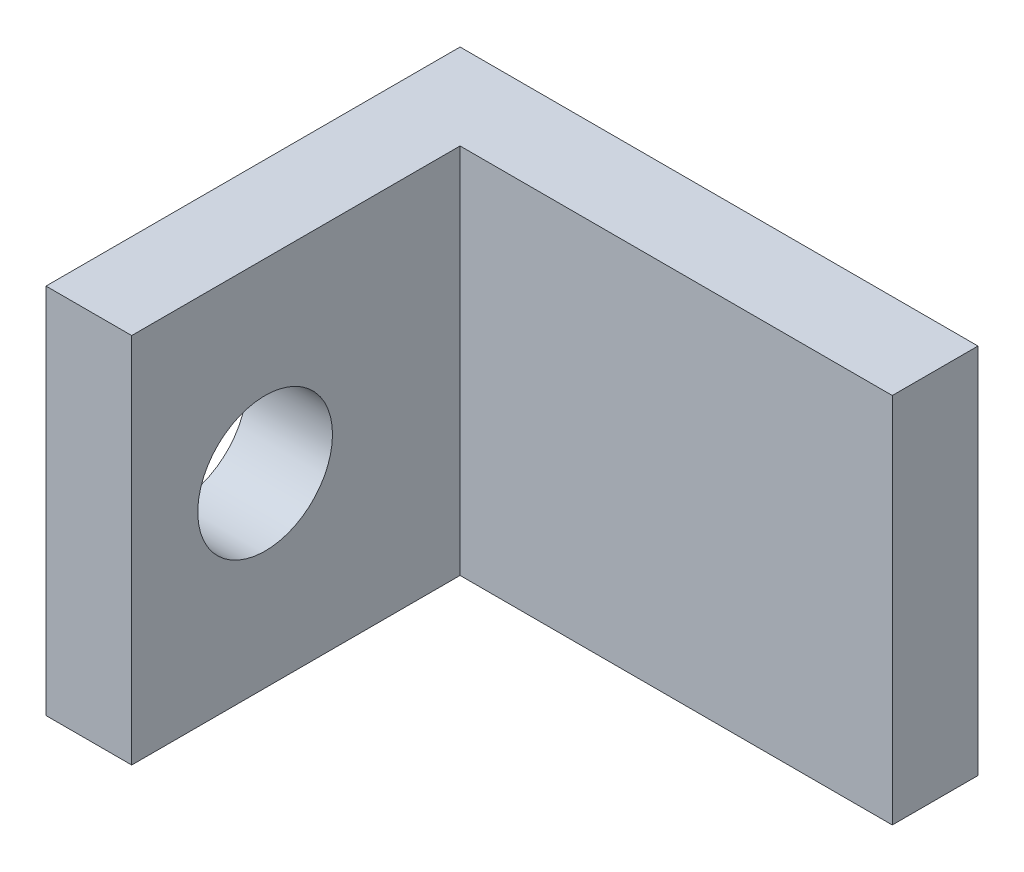
ISO-10303-21;
HEADER;
FILE_DESCRIPTION(('STEP AP214'),'2;1');
FILE_NAME('part.step','',(''),(''),'','','');
FILE_SCHEMA(('AUTOMOTIVE_DESIGN { 1 0 10303 214 1 1 1 1 }'));
ENDSEC;
DATA;
#1=APPLICATION_CONTEXT('core data for automotive mechanical design processes');
#2=APPLICATION_PROTOCOL_DEFINITION('international standard','automotive_design',2000,#1);
#3=PRODUCT_CONTEXT('',#1,'mechanical');
#4=PRODUCT('Part','Part','',(#3));
#5=PRODUCT_RELATED_PRODUCT_CATEGORY('part','',(#4));
#6=PRODUCT_DEFINITION_FORMATION('','',#4);
#7=PRODUCT_DEFINITION_CONTEXT('part definition',#1,'design');
#8=PRODUCT_DEFINITION('design','',#6,#7);
#9=PRODUCT_DEFINITION_SHAPE('','',#8);
#10=(LENGTH_UNIT() NAMED_UNIT(*) SI_UNIT(.MILLI.,.METRE.));
#11=(NAMED_UNIT(*) PLANE_ANGLE_UNIT() SI_UNIT($,.RADIAN.));
#12=(NAMED_UNIT(*) SI_UNIT($,.STERADIAN.) SOLID_ANGLE_UNIT());
#13=UNCERTAINTY_MEASURE_WITH_UNIT(LENGTH_MEASURE(1.E-05),#10,'distance_accuracy_value','');
#14=(GEOMETRIC_REPRESENTATION_CONTEXT(3) GLOBAL_UNCERTAINTY_ASSIGNED_CONTEXT((#13)) GLOBAL_UNIT_ASSIGNED_CONTEXT((#10,
#11,#12)) REPRESENTATION_CONTEXT('',''));
#15=CARTESIAN_POINT('',(0.,0.,0.));
#16=DIRECTION('',(0.,0.,1.));
#17=DIRECTION('',(1.,0.,0.));
#18=AXIS2_PLACEMENT_3D('',#15,#16,#17);
#19=CARTESIAN_POINT('',(7.87177572923137,-19.6707389390159,-6.36));
#20=DIRECTION('',(0.,1.,0.));
#21=DIRECTION('',(0.,0.,1.));
#22=AXIS2_PLACEMENT_3D('',#19,#20,#21);
#23=PLANE('',#22);
#24=DIRECTION('',(-1.,0.,0.));
#25=VECTOR('',#24,1.);
#26=CARTESIAN_POINT('',(7.87177572923137,-19.6707389390159,-3.18));
#27=LINE('',#26,#25);
#28=CARTESIAN_POINT('',(23.9095266764195,-19.6707389390159,-3.18));
#29=VERTEX_POINT('',#28);
#30=CARTESIAN_POINT('',(7.87177572923137,-19.6707389390159,-3.18));
#31=VERTEX_POINT('',#30);
#32=EDGE_CURVE('E78',#29,#31,#27,.T.);
#33=ORIENTED_EDGE('',*,*,#32,.F.);
#34=DIRECTION('',(0.,0.,1.));
#35=VECTOR('',#34,1.);
#36=CARTESIAN_POINT('',(23.9095266764195,-19.6707389390159,-6.36));
#37=LINE('',#36,#35);
#38=CARTESIAN_POINT('',(23.9095266764195,-19.6707389390159,-6.36));
#39=VERTEX_POINT('',#38);
#40=EDGE_CURVE('E11',#39,#29,#37,.T.);
#41=ORIENTED_EDGE('',*,*,#40,.F.);
#42=DIRECTION('',(-1.,0.,0.));
#43=VECTOR('',#42,1.);
#44=CARTESIAN_POINT('',(7.87177572923137,-19.6707389390159,-6.36));
#45=LINE('',#44,#43);
#46=CARTESIAN_POINT('',(4.69177572923136,-19.6707389390159,-6.36));
#47=VERTEX_POINT('',#46);
#48=EDGE_CURVE('E96',#39,#47,#45,.T.);
#49=ORIENTED_EDGE('',*,*,#48,.T.);
#50=DIRECTION('',(0.,0.,-1.));
#51=VECTOR('',#50,1.);
#52=CARTESIAN_POINT('',(4.69177572923136,-19.6707389390159,-6.36));
#53=LINE('',#52,#51);
#54=CARTESIAN_POINT('',(4.69177572923136,-19.6707389390159,9.00409404280822));
#55=VERTEX_POINT('',#54);
#56=EDGE_CURVE('E114',#55,#47,#53,.T.);
#57=ORIENTED_EDGE('',*,*,#56,.F.);
#58=DIRECTION('',(1.,0.,0.));
#59=VECTOR('',#58,1.);
#60=CARTESIAN_POINT('',(4.69177572923136,-19.6707389390159,9.00409404280822));
#61=LINE('',#60,#59);
#62=CARTESIAN_POINT('',(7.87177572923137,-19.6707389390159,9.00409404280822));
#63=VERTEX_POINT('',#62);
#64=EDGE_CURVE('E119',#55,#63,#61,.T.);
#65=ORIENTED_EDGE('',*,*,#64,.T.);
#66=DIRECTION('',(0.,0.,-1.));
#67=VECTOR('',#66,1.);
#68=CARTESIAN_POINT('',(7.87177572923137,-19.6707389390159,-6.36));
#69=LINE('',#68,#67);
#70=EDGE_CURVE('E84',#63,#31,#69,.T.);
#71=ORIENTED_EDGE('',*,*,#70,.T.);
#72=EDGE_LOOP('',(#33,#41,#49,#57,#65,#71));
#73=FACE_BOUND('',#72,.T.);
#74=ADVANCED_FACE('F34',(#73),#23,.T.);
#75=CARTESIAN_POINT('',(23.9095266764195,-19.6707389390159,-6.36));
#76=DIRECTION('',(1.,0.,0.));
#77=DIRECTION('',(0.,0.,-1.));
#78=AXIS2_PLACEMENT_3D('',#75,#76,#77);
#79=PLANE('',#78);
#80=DIRECTION('',(0.,1.,0.));
#81=VECTOR('',#80,1.);
#82=CARTESIAN_POINT('',(23.9095266764195,-19.6707389390159,-3.18));
#83=LINE('',#82,#81);
#84=CARTESIAN_POINT('',(23.9095266764195,-33.4727169539346,-3.18));
#85=VERTEX_POINT('',#84);
#86=EDGE_CURVE('E69',#85,#29,#83,.T.);
#87=ORIENTED_EDGE('',*,*,#86,.F.);
#88=DIRECTION('',(0.,0.,1.));
#89=VECTOR('',#88,1.);
#90=CARTESIAN_POINT('',(23.9095266764195,-33.4727169539346,-6.36));
#91=LINE('',#90,#89);
#92=CARTESIAN_POINT('',(23.9095266764195,-33.4727169539346,-6.36));
#93=VERTEX_POINT('',#92);
#94=EDGE_CURVE('E44',#93,#85,#91,.T.);
#95=ORIENTED_EDGE('',*,*,#94,.F.);
#96=DIRECTION('',(0.,1.,0.));
#97=VECTOR('',#96,1.);
#98=CARTESIAN_POINT('',(23.9095266764195,-19.6707389390159,-6.36));
#99=LINE('',#98,#97);
#100=EDGE_CURVE('E72',#93,#39,#99,.T.);
#101=ORIENTED_EDGE('',*,*,#100,.T.);
#102=ORIENTED_EDGE('',*,*,#40,.T.);
#103=EDGE_LOOP('',(#87,#95,#101,#102));
#104=FACE_BOUND('',#103,.T.);
#105=ADVANCED_FACE('F68',(#104),#79,.T.);
#106=CARTESIAN_POINT('',(7.87177572923137,-33.4727169539346,-6.36));
#107=DIRECTION('',(0.,-1.,0.));
#108=DIRECTION('',(0.,0.,-1.));
#109=AXIS2_PLACEMENT_3D('',#106,#107,#108);
#110=PLANE('',#109);
#111=DIRECTION('',(1.,0.,0.));
#112=VECTOR('',#111,1.);
#113=CARTESIAN_POINT('',(7.87177572923137,-33.4727169539346,-3.18));
#114=LINE('',#113,#112);
#115=CARTESIAN_POINT('',(7.87177572923137,-33.4727169539346,-3.18));
#116=VERTEX_POINT('',#115);
#117=EDGE_CURVE('E79',#116,#85,#114,.T.);
#118=ORIENTED_EDGE('',*,*,#117,.F.);
#119=DIRECTION('',(0.,0.,1.));
#120=VECTOR('',#119,1.);
#121=CARTESIAN_POINT('',(7.87177572923137,-33.4727169539346,-6.36000000000001));
#122=LINE('',#121,#120);
#123=CARTESIAN_POINT('',(7.87177572923137,-33.4727169539346,9.00409404280822));
#124=VERTEX_POINT('',#123);
#125=EDGE_CURVE('E103',#116,#124,#122,.T.);
#126=ORIENTED_EDGE('',*,*,#125,.T.);
#127=DIRECTION('',(1.,0.,0.));
#128=VECTOR('',#127,1.);
#129=CARTESIAN_POINT('',(4.69177572923136,-33.4727169539346,9.00409404280822));
#130=LINE('',#129,#128);
#131=CARTESIAN_POINT('',(4.69177572923136,-33.4727169539346,9.00409404280822));
#132=VERTEX_POINT('',#131);
#133=EDGE_CURVE('E91',#132,#124,#130,.T.);
#134=ORIENTED_EDGE('',*,*,#133,.F.);
#135=DIRECTION('',(0.,0.,1.));
#136=VECTOR('',#135,1.);
#137=CARTESIAN_POINT('',(4.69177572923136,-33.4727169539346,-6.36000000000001));
#138=LINE('',#137,#136);
#139=CARTESIAN_POINT('',(4.69177572923136,-33.4727169539346,-6.36000000000001));
#140=VERTEX_POINT('',#139);
#141=EDGE_CURVE('E141',#140,#132,#138,.T.);
#142=ORIENTED_EDGE('',*,*,#141,.F.);
#143=DIRECTION('',(1.,0.,0.));
#144=VECTOR('',#143,1.);
#145=CARTESIAN_POINT('',(7.87177572923137,-33.4727169539346,-6.36));
#146=LINE('',#145,#144);
#147=EDGE_CURVE('E85',#140,#93,#146,.T.);
#148=ORIENTED_EDGE('',*,*,#147,.T.);
#149=ORIENTED_EDGE('',*,*,#94,.T.);
#150=EDGE_LOOP('',(#118,#126,#134,#142,#148,#149));
#151=FACE_BOUND('',#150,.T.);
#152=ADVANCED_FACE('F36',(#151),#110,.T.);
#153=CARTESIAN_POINT('',(0.,0.,-6.36));
#154=DIRECTION('',(0.,0.,1.));
#155=DIRECTION('',(1.,0.,0.));
#156=AXIS2_PLACEMENT_3D('',#153,#154,#155);
#157=PLANE('',#156);
#158=ORIENTED_EDGE('',*,*,#147,.F.);
#159=DIRECTION('',(0.,-1.,0.));
#160=VECTOR('',#159,1.);
#161=CARTESIAN_POINT('',(4.69177572923136,-33.4727169539346,-6.36000000000001));
#162=LINE('',#161,#160);
#163=EDGE_CURVE('E139',#47,#140,#162,.T.);
#164=ORIENTED_EDGE('',*,*,#163,.F.);
#165=ORIENTED_EDGE('',*,*,#48,.F.);
#166=ORIENTED_EDGE('',*,*,#100,.F.);
#167=EDGE_LOOP('',(#158,#164,#165,#166));
#168=FACE_BOUND('',#167,.T.);
#169=ADVANCED_FACE('F156',(#168),#157,.F.);
#170=CARTESIAN_POINT('',(0.,0.,-3.18));
#171=DIRECTION('',(0.,0.,1.));
#172=DIRECTION('',(1.,0.,0.));
#173=AXIS2_PLACEMENT_3D('',#170,#171,#172);
#174=PLANE('',#173);
#175=DIRECTION('',(0.,-1.,0.));
#176=VECTOR('',#175,1.);
#177=CARTESIAN_POINT('',(7.87177572923137,-19.6707389390159,-3.18));
#178=LINE('',#177,#176);
#179=EDGE_CURVE('E88',#31,#116,#178,.T.);
#180=ORIENTED_EDGE('',*,*,#179,.T.);
#181=ORIENTED_EDGE('',*,*,#117,.T.);
#182=ORIENTED_EDGE('',*,*,#86,.T.);
#183=ORIENTED_EDGE('',*,*,#32,.T.);
#184=EDGE_LOOP('',(#180,#181,#182,#183));
#185=FACE_BOUND('',#184,.T.);
#186=ADVANCED_FACE('F77',(#185),#174,.T.);
#187=CARTESIAN_POINT('',(7.87177572923137,0.,0.));
#188=DIRECTION('',(1.,0.,0.));
#189=DIRECTION('',(0.,0.,-1.));
#190=AXIS2_PLACEMENT_3D('',#187,#188,#189);
#191=PLANE('',#190);
#192=CARTESIAN_POINT('',(7.87177572923137,-26.5717279464752,4.05367289920378));
#193=DIRECTION('',(-1.,0.,0.));
#194=DIRECTION('',(0.,0.,1.));
#195=AXIS2_PLACEMENT_3D('',#192,#193,#194);
#196=CIRCLE('',#195,2.4999999999999);
#197=CARTESIAN_POINT('',(7.87177572923137,-26.5717279464752,1.55367289920387));
#198=VERTEX_POINT('',#197);
#199=EDGE_CURVE('E148',#198,#198,#196,.T.);
#200=ORIENTED_EDGE('',*,*,#199,.T.);
#201=EDGE_LOOP('',(#200));
#202=FACE_BOUND('',#201,.T.);
#203=ORIENTED_EDGE('',*,*,#179,.F.);
#204=ORIENTED_EDGE('',*,*,#70,.F.);
#205=DIRECTION('',(0.,1.,0.));
#206=VECTOR('',#205,1.);
#207=CARTESIAN_POINT('',(7.87177572923137,-33.4727169539346,9.00409404280822));
#208=LINE('',#207,#206);
#209=EDGE_CURVE('E107',#124,#63,#208,.T.);
#210=ORIENTED_EDGE('',*,*,#209,.F.);
#211=ORIENTED_EDGE('',*,*,#125,.F.);
#212=EDGE_LOOP('',(#203,#204,#210,#211));
#213=FACE_BOUND('',#212,.T.);
#214=ADVANCED_FACE('F136',(#202,#213),#191,.T.);
#215=CARTESIAN_POINT('',(4.69177572923136,0.,0.));
#216=DIRECTION('',(1.,0.,0.));
#217=DIRECTION('',(0.,0.,-1.));
#218=AXIS2_PLACEMENT_3D('',#215,#216,#217);
#219=PLANE('',#218);
#220=ORIENTED_EDGE('',*,*,#163,.T.);
#221=ORIENTED_EDGE('',*,*,#141,.T.);
#222=DIRECTION('',(0.,1.,0.));
#223=VECTOR('',#222,1.);
#224=CARTESIAN_POINT('',(4.69177572923136,-33.4727169539346,9.00409404280822));
#225=LINE('',#224,#223);
#226=EDGE_CURVE('E131',#132,#55,#225,.T.);
#227=ORIENTED_EDGE('',*,*,#226,.T.);
#228=ORIENTED_EDGE('',*,*,#56,.T.);
#229=EDGE_LOOP('',(#220,#221,#227,#228));
#230=FACE_BOUND('',#229,.T.);
#231=CARTESIAN_POINT('',(4.69177572923136,-26.5717279464752,4.05367289920378));
#232=DIRECTION('',(-1.,0.,0.));
#233=DIRECTION('',(0.,0.,1.));
#234=AXIS2_PLACEMENT_3D('',#231,#232,#233);
#235=CIRCLE('',#234,2.4999999999999);
#236=CARTESIAN_POINT('',(4.69177572923137,-26.5717279464752,1.55367289920387));
#237=VERTEX_POINT('',#236);
#238=EDGE_CURVE('E108',#237,#237,#235,.T.);
#239=ORIENTED_EDGE('',*,*,#238,.F.);
#240=EDGE_LOOP('',(#239));
#241=FACE_BOUND('',#240,.T.);
#242=ADVANCED_FACE('F151',(#230,#241),#219,.F.);
#243=CARTESIAN_POINT('',(4.69177572923136,-33.4727169539346,9.00409404280822));
#244=DIRECTION('',(0.,0.,-1.));
#245=DIRECTION('',(-1.,0.,0.));
#246=AXIS2_PLACEMENT_3D('',#243,#244,#245);
#247=PLANE('',#246);
#248=ORIENTED_EDGE('',*,*,#209,.T.);
#249=ORIENTED_EDGE('',*,*,#64,.F.);
#250=ORIENTED_EDGE('',*,*,#226,.F.);
#251=ORIENTED_EDGE('',*,*,#133,.T.);
#252=EDGE_LOOP('',(#248,#249,#250,#251));
#253=FACE_BOUND('',#252,.T.);
#254=ADVANCED_FACE('F126',(#253),#247,.F.);
#255=CARTESIAN_POINT('',(4.69177572923136,-26.5717279464752,4.05367289920378));
#256=DIRECTION('',(1.,0.,0.));
#257=DIRECTION('',(0.,0.,-1.));
#258=AXIS2_PLACEMENT_3D('',#255,#256,#257);
#259=CYLINDRICAL_SURFACE('',#258,2.4999999999999);
#260=CARTESIAN_POINT('',(4.69177572923137,-26.5717279464752,1.55367289920387));
#261=CARTESIAN_POINT('',(4.72490072923137,-26.5717279464752,1.55367289920387));
#262=CARTESIAN_POINT('',(4.75802572923137,-26.5717279464752,1.55367289920387));
#263=CARTESIAN_POINT('',(4.82427572923137,-26.5717279464752,1.55367289920387));
#264=CARTESIAN_POINT('',(4.85740072923137,-26.5717279464752,1.55367289920387));
#265=CARTESIAN_POINT('',(4.92365072923137,-26.5717279464752,1.55367289920387));
#266=CARTESIAN_POINT('',(4.95677572923137,-26.5717279464752,1.55367289920387));
#267=CARTESIAN_POINT('',(5.02302572923137,-26.5717279464752,1.55367289920387));
#268=CARTESIAN_POINT('',(5.05615072923136,-26.5717279464752,1.55367289920387));
#269=CARTESIAN_POINT('',(5.12240072923137,-26.5717279464752,1.55367289920387));
#270=CARTESIAN_POINT('',(5.15552572923137,-26.5717279464752,1.55367289920387));
#271=CARTESIAN_POINT('',(5.22177572923137,-26.5717279464752,1.55367289920387));
#272=CARTESIAN_POINT('',(5.25490072923137,-26.5717279464752,1.55367289920387));
#273=CARTESIAN_POINT('',(5.32115072923137,-26.5717279464752,1.55367289920387));
#274=CARTESIAN_POINT('',(5.35427572923136,-26.5717279464752,1.55367289920387));
#275=CARTESIAN_POINT('',(5.42052572923137,-26.5717279464752,1.55367289920387));
#276=CARTESIAN_POINT('',(5.45365072923137,-26.5717279464752,1.55367289920387));
#277=CARTESIAN_POINT('',(5.51990072923137,-26.5717279464752,1.55367289920387));
#278=CARTESIAN_POINT('',(5.55302572923137,-26.5717279464752,1.55367289920387));
#279=CARTESIAN_POINT('',(5.61927572923137,-26.5717279464752,1.55367289920387));
#280=CARTESIAN_POINT('',(5.65240072923137,-26.5717279464752,1.55367289920387));
#281=CARTESIAN_POINT('',(5.71865072923137,-26.5717279464752,1.55367289920387));
#282=CARTESIAN_POINT('',(5.75177572923137,-26.5717279464752,1.55367289920387));
#283=CARTESIAN_POINT('',(5.81802572923137,-26.5717279464752,1.55367289920387));
#284=CARTESIAN_POINT('',(5.85115072923137,-26.5717279464752,1.55367289920387));
#285=CARTESIAN_POINT('',(5.91740072923137,-26.5717279464752,1.55367289920387));
#286=CARTESIAN_POINT('',(5.95052572923136,-26.5717279464752,1.55367289920387));
#287=CARTESIAN_POINT('',(6.01677572923137,-26.5717279464752,1.55367289920387));
#288=CARTESIAN_POINT('',(6.04990072923137,-26.5717279464752,1.55367289920387));
#289=CARTESIAN_POINT('',(6.11615072923137,-26.5717279464752,1.55367289920387));
#290=CARTESIAN_POINT('',(6.14927572923137,-26.5717279464752,1.55367289920387));
#291=CARTESIAN_POINT('',(6.21552572923137,-26.5717279464752,1.55367289920387));
#292=CARTESIAN_POINT('',(6.24865072923137,-26.5717279464752,1.55367289920387));
#293=CARTESIAN_POINT('',(6.31490072923137,-26.5717279464752,1.55367289920387));
#294=CARTESIAN_POINT('',(6.34802572923137,-26.5717279464752,1.55367289920387));
#295=CARTESIAN_POINT('',(6.41427572923137,-26.5717279464752,1.55367289920387));
#296=CARTESIAN_POINT('',(6.44740072923137,-26.5717279464752,1.55367289920387));
#297=CARTESIAN_POINT('',(6.51365072923137,-26.5717279464752,1.55367289920387));
#298=CARTESIAN_POINT('',(6.54677572923137,-26.5717279464752,1.55367289920387));
#299=CARTESIAN_POINT('',(6.61302572923137,-26.5717279464752,1.55367289920387));
#300=CARTESIAN_POINT('',(6.64615072923137,-26.5717279464752,1.55367289920387));
#301=CARTESIAN_POINT('',(6.71240072923137,-26.5717279464752,1.55367289920387));
#302=CARTESIAN_POINT('',(6.74552572923136,-26.5717279464752,1.55367289920387));
#303=CARTESIAN_POINT('',(6.81177572923136,-26.5717279464752,1.55367289920387));
#304=CARTESIAN_POINT('',(6.84490072923137,-26.5717279464752,1.55367289920387));
#305=CARTESIAN_POINT('',(6.91115072923137,-26.5717279464752,1.55367289920387));
#306=CARTESIAN_POINT('',(6.94427572923137,-26.5717279464752,1.55367289920387));
#307=CARTESIAN_POINT('',(7.01052572923137,-26.5717279464752,1.55367289920387));
#308=CARTESIAN_POINT('',(7.04365072923137,-26.5717279464752,1.55367289920387));
#309=CARTESIAN_POINT('',(7.10990072923137,-26.5717279464752,1.55367289920387));
#310=CARTESIAN_POINT('',(7.14302572923137,-26.5717279464752,1.55367289920387));
#311=CARTESIAN_POINT('',(7.20927572923137,-26.5717279464752,1.55367289920387));
#312=CARTESIAN_POINT('',(7.24240072923137,-26.5717279464752,1.55367289920387));
#313=CARTESIAN_POINT('',(7.30865072923137,-26.5717279464752,1.55367289920387));
#314=CARTESIAN_POINT('',(7.34177572923137,-26.5717279464752,1.55367289920387));
#315=CARTESIAN_POINT('',(7.40802572923137,-26.5717279464752,1.55367289920387));
#316=CARTESIAN_POINT('',(7.44115072923137,-26.5717279464752,1.55367289920387));
#317=CARTESIAN_POINT('',(7.50740072923137,-26.5717279464752,1.55367289920387));
#318=CARTESIAN_POINT('',(7.54052572923137,-26.5717279464752,1.55367289920387));
#319=CARTESIAN_POINT('',(7.60677572923137,-26.5717279464752,1.55367289920387));
#320=CARTESIAN_POINT('',(7.63990072923137,-26.5717279464752,1.55367289920387));
#321=CARTESIAN_POINT('',(7.70615072923137,-26.5717279464752,1.55367289920387));
#322=CARTESIAN_POINT('',(7.73927572923137,-26.5717279464752,1.55367289920387));
#323=CARTESIAN_POINT('',(7.80552572923137,-26.5717279464752,1.55367289920387));
#324=CARTESIAN_POINT('',(7.83865072923137,-26.5717279464752,1.55367289920387));
#325=CARTESIAN_POINT('',(7.87177572923137,-26.5717279464752,1.55367289920387));
#326=B_SPLINE_CURVE_WITH_KNOTS('',3,(#260,#261,#262,#263,#264,#265,#266,#267,#268,#269,#270,
#271,#272,#273,#274,#275,#276,#277,#278,#279,#280,#281,#282,#283,#284,#285,#286,#287,#288,#289,
#290,#291,#292,#293,#294,#295,#296,#297,#298,#299,#300,#301,#302,#303,#304,#305,#306,#307,#308,
#309,#310,#311,#312,#313,#314,#315,#316,#317,#318,#319,#320,#321,#322,#323,#324,#325),
.UNSPECIFIED.,.F.,.F.,(4,2,2,2,2,2,2,2,2,2,2,2,2,2,2,2,2,2,2,2,2,2,2,2,2,2,2,2,2,2,2,2,4),(0.,
0.0993749999999996,0.198749999999999,0.298125,0.397499999999999,0.496875,0.59625,
0.695624999999999,0.795,0.894375,0.99375,1.093125,1.1925,1.291875,1.39125,1.490625,1.59,
1.689375,1.78875,1.888125,1.9875,2.086875,2.18625,2.285625,2.385,2.484375,2.58375,2.683125,
2.7825,2.881875,2.98125,3.080625,3.18),.UNSPECIFIED.);
#327=EDGE_CURVE('BSEAM175',#237,#198,#326,.T.);
#328=ORIENTED_EDGE('',*,*,#238,.T.);
#329=ORIENTED_EDGE('',*,*,#199,.F.);
#330=ORIENTED_EDGE('',*,*,#327,.T.);
#331=ORIENTED_EDGE('',*,*,#327,.F.);
#332=EDGE_LOOP('',(#328,#330,#329,#331));
#333=FACE_BOUND('',#332,.T.);
#334=ADVANCED_FACE('F175',(#333),#259,.F.);
#335=CLOSED_SHELL('',(#74,#105,#152,#169,#186,#214,#242,#254,#334));
#336=MANIFOLD_SOLID_BREP('B2',#335);
#337=ADVANCED_BREP_SHAPE_REPRESENTATION('',(#18,#336),#14);
#338=SHAPE_DEFINITION_REPRESENTATION(#9,#337);
ENDSEC;
END-ISO-10303-21;
